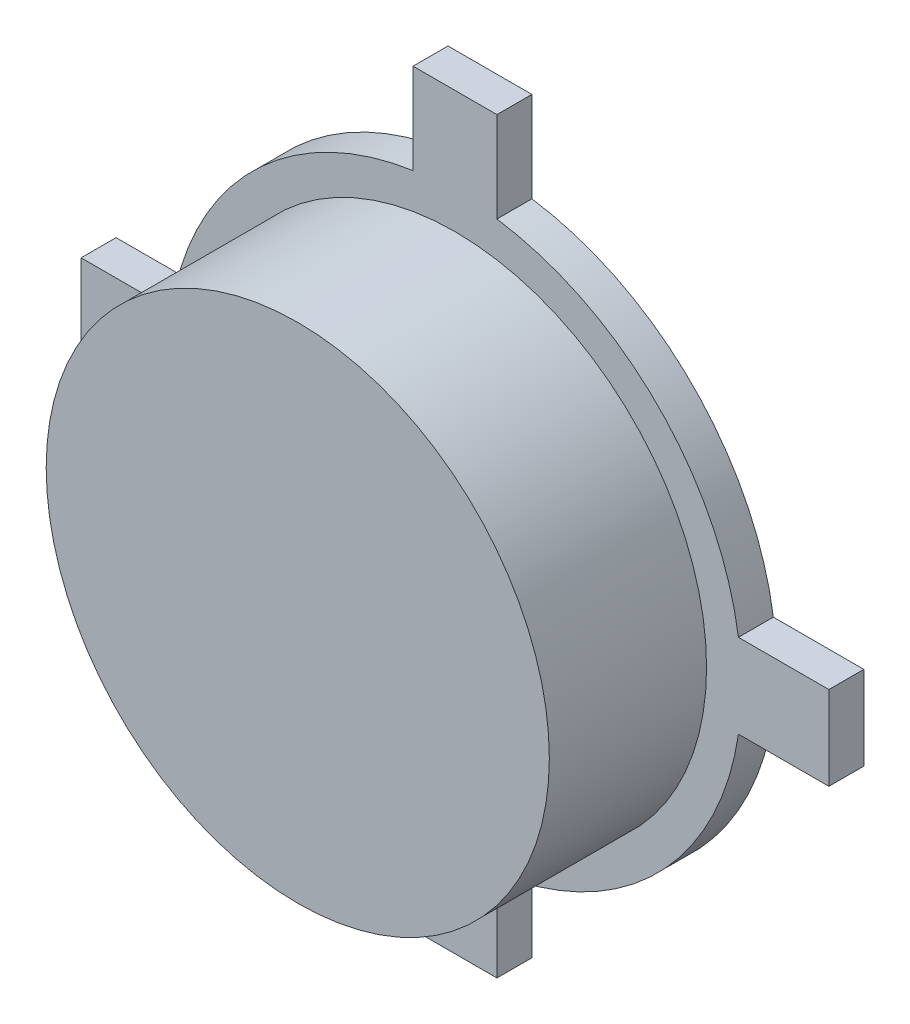
ISO-10303-21;
HEADER;
FILE_DESCRIPTION(('STEP AP214'),'2;1');
FILE_NAME('part.step','',(''),(''),'','','');
FILE_SCHEMA(('AUTOMOTIVE_DESIGN { 1 0 10303 214 1 1 1 1 }'));
ENDSEC;
DATA;
#1=APPLICATION_CONTEXT('core data for automotive mechanical design processes');
#2=APPLICATION_PROTOCOL_DEFINITION('international standard','automotive_design',2000,#1);
#3=PRODUCT_CONTEXT('',#1,'mechanical');
#4=PRODUCT('Part','Part','',(#3));
#5=PRODUCT_RELATED_PRODUCT_CATEGORY('part','',(#4));
#6=PRODUCT_DEFINITION_FORMATION('','',#4);
#7=PRODUCT_DEFINITION_CONTEXT('part definition',#1,'design');
#8=PRODUCT_DEFINITION('design','',#6,#7);
#9=PRODUCT_DEFINITION_SHAPE('','',#8);
#10=(LENGTH_UNIT() NAMED_UNIT(*) SI_UNIT(.MILLI.,.METRE.));
#11=(NAMED_UNIT(*) PLANE_ANGLE_UNIT() SI_UNIT($,.RADIAN.));
#12=(NAMED_UNIT(*) SI_UNIT($,.STERADIAN.) SOLID_ANGLE_UNIT());
#13=UNCERTAINTY_MEASURE_WITH_UNIT(LENGTH_MEASURE(1.E-05),#10,'distance_accuracy_value','');
#14=(GEOMETRIC_REPRESENTATION_CONTEXT(3) GLOBAL_UNCERTAINTY_ASSIGNED_CONTEXT((#13)) GLOBAL_UNIT_ASSIGNED_CONTEXT((#10,
#11,#12)) REPRESENTATION_CONTEXT('',''));
#15=CARTESIAN_POINT('',(0.,0.,0.));
#16=DIRECTION('',(0.,0.,1.));
#17=DIRECTION('',(1.,0.,0.));
#18=AXIS2_PLACEMENT_3D('',#15,#16,#17);
#19=CARTESIAN_POINT('',(0.,0.,4.5));
#20=DIRECTION('',(0.,0.,-1.));
#21=DIRECTION('',(-1.,0.,0.));
#22=AXIS2_PLACEMENT_3D('',#19,#20,#21);
#23=CYLINDRICAL_SURFACE('',#22,7.19999999999999);
#24=CARTESIAN_POINT('',(0.,0.,4.5));
#25=DIRECTION('',(0.,0.,1.));
#26=DIRECTION('',(1.,0.,0.));
#27=AXIS2_PLACEMENT_3D('',#24,#25,#26);
#28=CIRCLE('',#27,7.19999999999999);
#29=CARTESIAN_POINT('',(7.19999999999999,0.,4.5));
#30=VERTEX_POINT('',#29);
#31=EDGE_CURVE('E11',#30,#30,#28,.T.);
#32=ORIENTED_EDGE('',*,*,#31,.F.);
#33=EDGE_LOOP('',(#32));
#34=FACE_BOUND('',#33,.T.);
#35=CARTESIAN_POINT('',(0.,0.,0.));
#36=DIRECTION('',(0.,0.,-1.));
#37=DIRECTION('',(-1.,0.,0.));
#38=AXIS2_PLACEMENT_3D('',#35,#36,#37);
#39=CIRCLE('',#38,7.19999999999999);
#40=CARTESIAN_POINT('',(-7.19999999999999,0.,0.));
#41=VERTEX_POINT('',#40);
#42=EDGE_CURVE('E43',#41,#41,#39,.T.);
#43=ORIENTED_EDGE('',*,*,#42,.F.);
#44=EDGE_LOOP('',(#43));
#45=FACE_BOUND('',#44,.T.);
#46=ADVANCED_FACE('F35',(#34,#45),#23,.T.);
#47=CARTESIAN_POINT('',(0.,0.,4.5));
#48=DIRECTION('',(0.,0.,1.));
#49=DIRECTION('',(1.,0.,0.));
#50=AXIS2_PLACEMENT_3D('',#47,#48,#49);
#51=PLANE('',#50);
#52=ORIENTED_EDGE('',*,*,#31,.T.);
#53=EDGE_LOOP('',(#52));
#54=FACE_BOUND('',#53,.T.);
#55=ADVANCED_FACE('F255',(#54),#51,.T.);
#56=CARTESIAN_POINT('',(-10.7,-1.20000000000001,-1.));
#57=DIRECTION('',(1.,0.,0.));
#58=DIRECTION('',(0.,0.,-1.));
#59=AXIS2_PLACEMENT_3D('',#56,#57,#58);
#60=PLANE('',#59);
#61=DIRECTION('',(0.,1.,0.));
#62=VECTOR('',#61,1.);
#63=CARTESIAN_POINT('',(-10.7,-1.20000000000001,0.));
#64=LINE('',#63,#62);
#65=CARTESIAN_POINT('',(-10.7,-1.20000000000001,0.));
#66=VERTEX_POINT('',#65);
#67=CARTESIAN_POINT('',(-10.7,1.20000000000001,0.));
#68=VERTEX_POINT('',#67);
#69=EDGE_CURVE('E180',#66,#68,#64,.T.);
#70=ORIENTED_EDGE('',*,*,#69,.T.);
#71=DIRECTION('',(0.,0.,1.));
#72=VECTOR('',#71,1.);
#73=CARTESIAN_POINT('',(-10.7,1.20000000000001,-1.));
#74=LINE('',#73,#72);
#75=CARTESIAN_POINT('',(-10.7,1.20000000000001,-1.));
#76=VERTEX_POINT('',#75);
#77=EDGE_CURVE('E247',#76,#68,#74,.T.);
#78=ORIENTED_EDGE('',*,*,#77,.F.);
#79=DIRECTION('',(0.,1.,0.));
#80=VECTOR('',#79,1.);
#81=CARTESIAN_POINT('',(-10.7,-1.20000000000001,-1.));
#82=LINE('',#81,#80);
#83=CARTESIAN_POINT('',(-10.7,-1.20000000000001,-1.));
#84=VERTEX_POINT('',#83);
#85=EDGE_CURVE('E210',#84,#76,#82,.T.);
#86=ORIENTED_EDGE('',*,*,#85,.F.);
#87=DIRECTION('',(0.,0.,1.));
#88=VECTOR('',#87,1.);
#89=CARTESIAN_POINT('',(-10.7,-1.20000000000001,-1.));
#90=LINE('',#89,#88);
#91=EDGE_CURVE('E176',#84,#66,#90,.T.);
#92=ORIENTED_EDGE('',*,*,#91,.T.);
#93=EDGE_LOOP('',(#70,#78,#86,#92));
#94=FACE_BOUND('',#93,.T.);
#95=ADVANCED_FACE('F260',(#94),#60,.F.);
#96=CARTESIAN_POINT('',(-10.7,1.20000000000001,-1.));
#97=DIRECTION('',(0.,-1.,0.));
#98=DIRECTION('',(1.,0.,0.));
#99=AXIS2_PLACEMENT_3D('',#96,#97,#98);
#100=PLANE('',#99);
#101=DIRECTION('',(1.,0.,0.));
#102=VECTOR('',#101,1.);
#103=CARTESIAN_POINT('',(-10.7,1.20000000000001,0.));
#104=LINE('',#103,#102);
#105=CARTESIAN_POINT('',(-8.11171991626927,1.2000000000001,0.));
#106=VERTEX_POINT('',#105);
#107=EDGE_CURVE('E183',#68,#106,#104,.T.);
#108=ORIENTED_EDGE('',*,*,#107,.T.);
#109=DIRECTION('',(0.,0.,1.));
#110=VECTOR('',#109,1.);
#111=CARTESIAN_POINT('',(-8.11171991626927,1.2000000000001,-1.));
#112=LINE('',#111,#110);
#113=CARTESIAN_POINT('',(-8.11171991626927,1.2000000000001,-1.));
#114=VERTEX_POINT('',#113);
#115=EDGE_CURVE('E244',#114,#106,#112,.T.);
#116=ORIENTED_EDGE('',*,*,#115,.F.);
#117=DIRECTION('',(1.,0.,0.));
#118=VECTOR('',#117,1.);
#119=CARTESIAN_POINT('',(-10.7,1.20000000000001,-1.));
#120=LINE('',#119,#118);
#121=EDGE_CURVE('E119',#76,#114,#120,.T.);
#122=ORIENTED_EDGE('',*,*,#121,.F.);
#123=ORIENTED_EDGE('',*,*,#77,.T.);
#124=EDGE_LOOP('',(#108,#116,#122,#123));
#125=FACE_BOUND('',#124,.T.);
#126=ADVANCED_FACE('F266',(#125),#100,.F.);
#127=CARTESIAN_POINT('',(0.,0.,-1.));
#128=DIRECTION('',(0.,0.,1.));
#129=DIRECTION('',(1.,0.,0.));
#130=AXIS2_PLACEMENT_3D('',#127,#128,#129);
#131=CYLINDRICAL_SURFACE('',#130,8.19999999999999);
#132=CARTESIAN_POINT('',(0.,0.,0.));
#133=DIRECTION('',(0.,0.,-1.));
#134=DIRECTION('',(-1.,0.,0.));
#135=AXIS2_PLACEMENT_3D('',#132,#133,#134);
#136=CIRCLE('',#135,8.19999999999999);
#137=CARTESIAN_POINT('',(-1.20000000000012,8.11171991626927,0.));
#138=VERTEX_POINT('',#137);
#139=EDGE_CURVE('E185',#106,#138,#136,.T.);
#140=ORIENTED_EDGE('',*,*,#139,.T.);
#141=DIRECTION('',(0.,0.,1.));
#142=VECTOR('',#141,1.);
#143=CARTESIAN_POINT('',(-1.20000000000012,8.11171991626927,-1.));
#144=LINE('',#143,#142);
#145=CARTESIAN_POINT('',(-1.20000000000012,8.11171991626927,-1.));
#146=VERTEX_POINT('',#145);
#147=EDGE_CURVE('E241',#146,#138,#144,.T.);
#148=ORIENTED_EDGE('',*,*,#147,.F.);
#149=CARTESIAN_POINT('',(0.,0.,-1.));
#150=DIRECTION('',(0.,0.,-1.));
#151=DIRECTION('',(-1.,0.,0.));
#152=AXIS2_PLACEMENT_3D('',#149,#150,#151);
#153=CIRCLE('',#152,8.19999999999999);
#154=EDGE_CURVE('E450',#114,#146,#153,.T.);
#155=ORIENTED_EDGE('',*,*,#154,.F.);
#156=ORIENTED_EDGE('',*,*,#115,.T.);
#157=EDGE_LOOP('',(#140,#148,#155,#156));
#158=FACE_BOUND('',#157,.T.);
#159=ADVANCED_FACE('F272',(#158),#131,.T.);
#160=CARTESIAN_POINT('',(-1.20000000000012,8.11171991626927,-1.));
#161=DIRECTION('',(1.,0.,0.));
#162=DIRECTION('',(0.,1.,0.));
#163=AXIS2_PLACEMENT_3D('',#160,#161,#162);
#164=PLANE('',#163);
#165=DIRECTION('',(0.,1.,0.));
#166=VECTOR('',#165,1.);
#167=CARTESIAN_POINT('',(-1.20000000000012,8.11171991626927,0.));
#168=LINE('',#167,#166);
#169=CARTESIAN_POINT('',(-1.20000000000001,10.7,0.));
#170=VERTEX_POINT('',#169);
#171=EDGE_CURVE('E187',#138,#170,#168,.T.);
#172=ORIENTED_EDGE('',*,*,#171,.T.);
#173=DIRECTION('',(0.,0.,1.));
#174=VECTOR('',#173,1.);
#175=CARTESIAN_POINT('',(-1.20000000000001,10.7,-1.));
#176=LINE('',#175,#174);
#177=CARTESIAN_POINT('',(-1.20000000000001,10.7,-1.));
#178=VERTEX_POINT('',#177);
#179=EDGE_CURVE('E238',#178,#170,#176,.T.);
#180=ORIENTED_EDGE('',*,*,#179,.F.);
#181=DIRECTION('',(0.,1.,0.));
#182=VECTOR('',#181,1.);
#183=CARTESIAN_POINT('',(-1.20000000000012,8.11171991626927,-1.));
#184=LINE('',#183,#182);
#185=EDGE_CURVE('E454',#146,#178,#184,.T.);
#186=ORIENTED_EDGE('',*,*,#185,.F.);
#187=ORIENTED_EDGE('',*,*,#147,.T.);
#188=EDGE_LOOP('',(#172,#180,#186,#187));
#189=FACE_BOUND('',#188,.T.);
#190=ADVANCED_FACE('F275',(#189),#164,.F.);
#191=CARTESIAN_POINT('',(-1.20000000000001,10.7,-1.));
#192=DIRECTION('',(0.,-1.,0.));
#193=DIRECTION('',(1.,0.,0.));
#194=AXIS2_PLACEMENT_3D('',#191,#192,#193);
#195=PLANE('',#194);
#196=DIRECTION('',(1.,0.,0.));
#197=VECTOR('',#196,1.);
#198=CARTESIAN_POINT('',(-1.20000000000001,10.7,0.));
#199=LINE('',#198,#197);
#200=CARTESIAN_POINT('',(1.20000000000002,10.7,0.));
#201=VERTEX_POINT('',#200);
#202=EDGE_CURVE('E189',#170,#201,#199,.T.);
#203=ORIENTED_EDGE('',*,*,#202,.T.);
#204=DIRECTION('',(0.,0.,1.));
#205=VECTOR('',#204,1.);
#206=CARTESIAN_POINT('',(1.20000000000002,10.7,-1.));
#207=LINE('',#206,#205);
#208=CARTESIAN_POINT('',(1.20000000000002,10.7,-1.));
#209=VERTEX_POINT('',#208);
#210=EDGE_CURVE('E235',#209,#201,#207,.T.);
#211=ORIENTED_EDGE('',*,*,#210,.F.);
#212=DIRECTION('',(1.,0.,0.));
#213=VECTOR('',#212,1.);
#214=CARTESIAN_POINT('',(-1.20000000000001,10.7,-1.));
#215=LINE('',#214,#213);
#216=EDGE_CURVE('E456',#178,#209,#215,.T.);
#217=ORIENTED_EDGE('',*,*,#216,.F.);
#218=ORIENTED_EDGE('',*,*,#179,.T.);
#219=EDGE_LOOP('',(#203,#211,#217,#218));
#220=FACE_BOUND('',#219,.T.);
#221=ADVANCED_FACE('F279',(#220),#195,.F.);
#222=CARTESIAN_POINT('',(1.20000000000002,10.7,-1.));
#223=DIRECTION('',(-1.,0.,0.));
#224=DIRECTION('',(0.,-1.,0.));
#225=AXIS2_PLACEMENT_3D('',#222,#223,#224);
#226=PLANE('',#225);
#227=DIRECTION('',(0.,-1.,0.));
#228=VECTOR('',#227,1.);
#229=CARTESIAN_POINT('',(1.20000000000002,10.7,0.));
#230=LINE('',#229,#228);
#231=CARTESIAN_POINT('',(1.20000000000018,8.11171991626926,0.));
#232=VERTEX_POINT('',#231);
#233=EDGE_CURVE('E191',#201,#232,#230,.T.);
#234=ORIENTED_EDGE('',*,*,#233,.T.);
#235=DIRECTION('',(0.,0.,1.));
#236=VECTOR('',#235,1.);
#237=CARTESIAN_POINT('',(1.20000000000018,8.11171991626926,-1.));
#238=LINE('',#237,#236);
#239=CARTESIAN_POINT('',(1.20000000000018,8.11171991626926,-1.));
#240=VERTEX_POINT('',#239);
#241=EDGE_CURVE('E232',#240,#232,#238,.T.);
#242=ORIENTED_EDGE('',*,*,#241,.F.);
#243=DIRECTION('',(0.,-1.,0.));
#244=VECTOR('',#243,1.);
#245=CARTESIAN_POINT('',(1.20000000000002,10.7,-1.));
#246=LINE('',#245,#244);
#247=EDGE_CURVE('E458',#209,#240,#246,.T.);
#248=ORIENTED_EDGE('',*,*,#247,.F.);
#249=ORIENTED_EDGE('',*,*,#210,.T.);
#250=EDGE_LOOP('',(#234,#242,#248,#249));
#251=FACE_BOUND('',#250,.T.);
#252=ADVANCED_FACE('F283',(#251),#226,.F.);
#253=CARTESIAN_POINT('',(0.,0.,-1.));
#254=DIRECTION('',(0.,0.,1.));
#255=DIRECTION('',(1.,0.,0.));
#256=AXIS2_PLACEMENT_3D('',#253,#254,#255);
#257=CYLINDRICAL_SURFACE('',#256,8.19999999999999);
#258=CARTESIAN_POINT('',(0.,0.,0.));
#259=DIRECTION('',(0.,0.,-1.));
#260=DIRECTION('',(-1.,0.,0.));
#261=AXIS2_PLACEMENT_3D('',#258,#259,#260);
#262=CIRCLE('',#261,8.19999999999999);
#263=CARTESIAN_POINT('',(8.11171991626929,1.20000000000001,0.));
#264=VERTEX_POINT('',#263);
#265=EDGE_CURVE('E193',#232,#264,#262,.T.);
#266=ORIENTED_EDGE('',*,*,#265,.T.);
#267=DIRECTION('',(0.,0.,1.));
#268=VECTOR('',#267,1.);
#269=CARTESIAN_POINT('',(8.11171991626929,1.20000000000001,-1.));
#270=LINE('',#269,#268);
#271=CARTESIAN_POINT('',(8.11171991626929,1.20000000000001,-1.));
#272=VERTEX_POINT('',#271);
#273=EDGE_CURVE('E229',#272,#264,#270,.T.);
#274=ORIENTED_EDGE('',*,*,#273,.F.);
#275=CARTESIAN_POINT('',(0.,0.,-1.));
#276=DIRECTION('',(0.,0.,-1.));
#277=DIRECTION('',(-1.,0.,0.));
#278=AXIS2_PLACEMENT_3D('',#275,#276,#277);
#279=CIRCLE('',#278,8.19999999999999);
#280=EDGE_CURVE('E460',#240,#272,#279,.T.);
#281=ORIENTED_EDGE('',*,*,#280,.F.);
#282=ORIENTED_EDGE('',*,*,#241,.T.);
#283=EDGE_LOOP('',(#266,#274,#281,#282));
#284=FACE_BOUND('',#283,.T.);
#285=ADVANCED_FACE('F287',(#284),#257,.T.);
#286=CARTESIAN_POINT('',(8.11171991626929,1.20000000000001,-1.));
#287=DIRECTION('',(0.,-1.,0.));
#288=DIRECTION('',(0.,0.,-1.));
#289=AXIS2_PLACEMENT_3D('',#286,#287,#288);
#290=PLANE('',#289);
#291=DIRECTION('',(1.,0.,0.));
#292=VECTOR('',#291,1.);
#293=CARTESIAN_POINT('',(8.11171991626929,1.20000000000001,0.));
#294=LINE('',#293,#292);
#295=CARTESIAN_POINT('',(10.7,1.20000000000001,0.));
#296=VERTEX_POINT('',#295);
#297=EDGE_CURVE('E195',#264,#296,#294,.T.);
#298=ORIENTED_EDGE('',*,*,#297,.T.);
#299=DIRECTION('',(0.,0.,1.));
#300=VECTOR('',#299,1.);
#301=CARTESIAN_POINT('',(10.7,1.20000000000001,-1.));
#302=LINE('',#301,#300);
#303=CARTESIAN_POINT('',(10.7,1.20000000000001,-1.));
#304=VERTEX_POINT('',#303);
#305=EDGE_CURVE('E226',#304,#296,#302,.T.);
#306=ORIENTED_EDGE('',*,*,#305,.F.);
#307=DIRECTION('',(1.,0.,0.));
#308=VECTOR('',#307,1.);
#309=CARTESIAN_POINT('',(8.11171991626929,1.20000000000001,-1.));
#310=LINE('',#309,#308);
#311=EDGE_CURVE('E462',#272,#304,#310,.T.);
#312=ORIENTED_EDGE('',*,*,#311,.F.);
#313=ORIENTED_EDGE('',*,*,#273,.T.);
#314=EDGE_LOOP('',(#298,#306,#312,#313));
#315=FACE_BOUND('',#314,.T.);
#316=ADVANCED_FACE('F291',(#315),#290,.F.);
#317=CARTESIAN_POINT('',(10.7,1.20000000000001,-1.));
#318=DIRECTION('',(-1.,0.,0.));
#319=DIRECTION('',(0.,0.,1.));
#320=AXIS2_PLACEMENT_3D('',#317,#318,#319);
#321=PLANE('',#320);
#322=DIRECTION('',(0.,-1.,0.));
#323=VECTOR('',#322,1.);
#324=CARTESIAN_POINT('',(10.7,1.20000000000001,0.));
#325=LINE('',#324,#323);
#326=CARTESIAN_POINT('',(10.7,-1.19999999999999,0.));
#327=VERTEX_POINT('',#326);
#328=EDGE_CURVE('E197',#296,#327,#325,.T.);
#329=ORIENTED_EDGE('',*,*,#328,.T.);
#330=DIRECTION('',(0.,0.,1.));
#331=VECTOR('',#330,1.);
#332=CARTESIAN_POINT('',(10.7,-1.19999999999999,-1.));
#333=LINE('',#332,#331);
#334=CARTESIAN_POINT('',(10.7,-1.19999999999999,-1.));
#335=VERTEX_POINT('',#334);
#336=EDGE_CURVE('E223',#335,#327,#333,.T.);
#337=ORIENTED_EDGE('',*,*,#336,.F.);
#338=DIRECTION('',(0.,-1.,0.));
#339=VECTOR('',#338,1.);
#340=CARTESIAN_POINT('',(10.7,1.20000000000001,-1.));
#341=LINE('',#340,#339);
#342=EDGE_CURVE('E464',#304,#335,#341,.T.);
#343=ORIENTED_EDGE('',*,*,#342,.F.);
#344=ORIENTED_EDGE('',*,*,#305,.T.);
#345=EDGE_LOOP('',(#329,#337,#343,#344));
#346=FACE_BOUND('',#345,.T.);
#347=ADVANCED_FACE('F295',(#346),#321,.F.);
#348=CARTESIAN_POINT('',(10.7,-1.19999999999999,-1.));
#349=DIRECTION('',(0.,1.,0.));
#350=DIRECTION('',(-1.,0.,0.));
#351=AXIS2_PLACEMENT_3D('',#348,#349,#350);
#352=PLANE('',#351);
#353=DIRECTION('',(-1.,0.,0.));
#354=VECTOR('',#353,1.);
#355=CARTESIAN_POINT('',(10.7,-1.19999999999999,0.));
#356=LINE('',#355,#354);
#357=CARTESIAN_POINT('',(8.11171991626929,-1.19999999999998,0.));
#358=VERTEX_POINT('',#357);
#359=EDGE_CURVE('E199',#327,#358,#356,.T.);
#360=ORIENTED_EDGE('',*,*,#359,.T.);
#361=DIRECTION('',(0.,0.,1.));
#362=VECTOR('',#361,1.);
#363=CARTESIAN_POINT('',(8.11171991626929,-1.19999999999998,-1.));
#364=LINE('',#363,#362);
#365=CARTESIAN_POINT('',(8.11171991626929,-1.19999999999998,-1.));
#366=VERTEX_POINT('',#365);
#367=EDGE_CURVE('E220',#366,#358,#364,.T.);
#368=ORIENTED_EDGE('',*,*,#367,.F.);
#369=DIRECTION('',(-1.,0.,0.));
#370=VECTOR('',#369,1.);
#371=CARTESIAN_POINT('',(10.7,-1.19999999999999,-1.));
#372=LINE('',#371,#370);
#373=EDGE_CURVE('E466',#335,#366,#372,.T.);
#374=ORIENTED_EDGE('',*,*,#373,.F.);
#375=ORIENTED_EDGE('',*,*,#336,.T.);
#376=EDGE_LOOP('',(#360,#368,#374,#375));
#377=FACE_BOUND('',#376,.T.);
#378=ADVANCED_FACE('F299',(#377),#352,.F.);
#379=CARTESIAN_POINT('',(0.,0.,-1.));
#380=DIRECTION('',(0.,0.,1.));
#381=DIRECTION('',(1.,0.,0.));
#382=AXIS2_PLACEMENT_3D('',#379,#380,#381);
#383=CYLINDRICAL_SURFACE('',#382,8.19999999999999);
#384=CARTESIAN_POINT('',(0.,0.,0.));
#385=DIRECTION('',(0.,0.,-1.));
#386=DIRECTION('',(-1.,0.,0.));
#387=AXIS2_PLACEMENT_3D('',#384,#385,#386);
#388=CIRCLE('',#387,8.19999999999999);
#389=CARTESIAN_POINT('',(1.2,-8.11171991626928,0.));
#390=VERTEX_POINT('',#389);
#391=EDGE_CURVE('E201',#358,#390,#388,.T.);
#392=ORIENTED_EDGE('',*,*,#391,.T.);
#393=DIRECTION('',(0.,0.,1.));
#394=VECTOR('',#393,1.);
#395=CARTESIAN_POINT('',(1.2,-8.11171991626928,-1.));
#396=LINE('',#395,#394);
#397=CARTESIAN_POINT('',(1.2,-8.11171991626928,-1.));
#398=VERTEX_POINT('',#397);
#399=EDGE_CURVE('E217',#398,#390,#396,.T.);
#400=ORIENTED_EDGE('',*,*,#399,.F.);
#401=CARTESIAN_POINT('',(0.,0.,-1.));
#402=DIRECTION('',(0.,0.,-1.));
#403=DIRECTION('',(-1.,0.,0.));
#404=AXIS2_PLACEMENT_3D('',#401,#402,#403);
#405=CIRCLE('',#404,8.19999999999999);
#406=EDGE_CURVE('E468',#366,#398,#405,.T.);
#407=ORIENTED_EDGE('',*,*,#406,.F.);
#408=ORIENTED_EDGE('',*,*,#367,.T.);
#409=EDGE_LOOP('',(#392,#400,#407,#408));
#410=FACE_BOUND('',#409,.T.);
#411=ADVANCED_FACE('F303',(#410),#383,.T.);
#412=CARTESIAN_POINT('',(1.2,-8.11171991626928,-1.));
#413=DIRECTION('',(-1.,0.,0.));
#414=DIRECTION('',(0.,0.,1.));
#415=AXIS2_PLACEMENT_3D('',#412,#413,#414);
#416=PLANE('',#415);
#417=DIRECTION('',(0.,-1.,0.));
#418=VECTOR('',#417,1.);
#419=CARTESIAN_POINT('',(1.2,-8.11171991626928,0.));
#420=LINE('',#419,#418);
#421=CARTESIAN_POINT('',(1.2,-10.7,0.));
#422=VERTEX_POINT('',#421);
#423=EDGE_CURVE('E203',#390,#422,#420,.T.);
#424=ORIENTED_EDGE('',*,*,#423,.T.);
#425=DIRECTION('',(0.,0.,1.));
#426=VECTOR('',#425,1.);
#427=CARTESIAN_POINT('',(1.2,-10.7,-1.));
#428=LINE('',#427,#426);
#429=CARTESIAN_POINT('',(1.2,-10.7,-1.));
#430=VERTEX_POINT('',#429);
#431=EDGE_CURVE('E214',#430,#422,#428,.T.);
#432=ORIENTED_EDGE('',*,*,#431,.F.);
#433=DIRECTION('',(0.,-1.,0.));
#434=VECTOR('',#433,1.);
#435=CARTESIAN_POINT('',(1.2,-8.11171991626928,-1.));
#436=LINE('',#435,#434);
#437=EDGE_CURVE('E470',#398,#430,#436,.T.);
#438=ORIENTED_EDGE('',*,*,#437,.F.);
#439=ORIENTED_EDGE('',*,*,#399,.T.);
#440=EDGE_LOOP('',(#424,#432,#438,#439));
#441=FACE_BOUND('',#440,.T.);
#442=ADVANCED_FACE('F307',(#441),#416,.F.);
#443=CARTESIAN_POINT('',(1.2,-10.7,-1.));
#444=DIRECTION('',(0.,1.,0.));
#445=DIRECTION('',(-1.,0.,0.));
#446=AXIS2_PLACEMENT_3D('',#443,#444,#445);
#447=PLANE('',#446);
#448=DIRECTION('',(-1.,0.,0.));
#449=VECTOR('',#448,1.);
#450=CARTESIAN_POINT('',(1.2,-10.7,0.));
#451=LINE('',#450,#449);
#452=CARTESIAN_POINT('',(-1.2,-10.7,0.));
#453=VERTEX_POINT('',#452);
#454=EDGE_CURVE('E205',#422,#453,#451,.T.);
#455=ORIENTED_EDGE('',*,*,#454,.T.);
#456=DIRECTION('',(0.,0.,1.));
#457=VECTOR('',#456,1.);
#458=CARTESIAN_POINT('',(-1.2,-10.7,-1.));
#459=LINE('',#458,#457);
#460=CARTESIAN_POINT('',(-1.2,-10.7,-1.));
#461=VERTEX_POINT('',#460);
#462=EDGE_CURVE('E171',#461,#453,#459,.T.);
#463=ORIENTED_EDGE('',*,*,#462,.F.);
#464=DIRECTION('',(-1.,0.,0.));
#465=VECTOR('',#464,1.);
#466=CARTESIAN_POINT('',(1.2,-10.7,-1.));
#467=LINE('',#466,#465);
#468=EDGE_CURVE('E162',#430,#461,#467,.T.);
#469=ORIENTED_EDGE('',*,*,#468,.F.);
#470=ORIENTED_EDGE('',*,*,#431,.T.);
#471=EDGE_LOOP('',(#455,#463,#469,#470));
#472=FACE_BOUND('',#471,.T.);
#473=ADVANCED_FACE('F311',(#472),#447,.F.);
#474=CARTESIAN_POINT('',(-1.2,-10.7,-1.));
#475=DIRECTION('',(1.,0.,0.));
#476=DIRECTION('',(0.,1.,0.));
#477=AXIS2_PLACEMENT_3D('',#474,#475,#476);
#478=PLANE('',#477);
#479=DIRECTION('',(0.,1.,0.));
#480=VECTOR('',#479,1.);
#481=CARTESIAN_POINT('',(-1.2,-10.7,0.));
#482=LINE('',#481,#480);
#483=CARTESIAN_POINT('',(-1.20000000000001,-8.11171991626929,0.));
#484=VERTEX_POINT('',#483);
#485=EDGE_CURVE('E170',#453,#484,#482,.T.);
#486=ORIENTED_EDGE('',*,*,#485,.T.);
#487=DIRECTION('',(0.,0.,1.));
#488=VECTOR('',#487,1.);
#489=CARTESIAN_POINT('',(-1.20000000000001,-8.11171991626929,-1.));
#490=LINE('',#489,#488);
#491=CARTESIAN_POINT('',(-1.20000000000001,-8.11171991626929,-1.));
#492=VERTEX_POINT('',#491);
#493=EDGE_CURVE('E167',#492,#484,#490,.T.);
#494=ORIENTED_EDGE('',*,*,#493,.F.);
#495=DIRECTION('',(0.,1.,0.));
#496=VECTOR('',#495,1.);
#497=CARTESIAN_POINT('',(-1.2,-10.7,-1.));
#498=LINE('',#497,#496);
#499=EDGE_CURVE('E156',#461,#492,#498,.T.);
#500=ORIENTED_EDGE('',*,*,#499,.F.);
#501=ORIENTED_EDGE('',*,*,#462,.T.);
#502=EDGE_LOOP('',(#486,#494,#500,#501));
#503=FACE_BOUND('',#502,.T.);
#504=ADVANCED_FACE('F168',(#503),#478,.F.);
#505=CARTESIAN_POINT('',(0.,0.,-1.));
#506=DIRECTION('',(0.,0.,1.));
#507=DIRECTION('',(1.,0.,0.));
#508=AXIS2_PLACEMENT_3D('',#505,#506,#507);
#509=CYLINDRICAL_SURFACE('',#508,8.19999999999999);
#510=CARTESIAN_POINT('',(0.,0.,0.));
#511=DIRECTION('',(0.,0.,-1.));
#512=DIRECTION('',(-1.,0.,0.));
#513=AXIS2_PLACEMENT_3D('',#510,#511,#512);
#514=CIRCLE('',#513,8.19999999999999);
#515=CARTESIAN_POINT('',(-8.11171991626927,-1.20000000000012,0.));
#516=VERTEX_POINT('',#515);
#517=EDGE_CURVE('E104',#484,#516,#514,.T.);
#518=ORIENTED_EDGE('',*,*,#517,.T.);
#519=DIRECTION('',(0.,0.,1.));
#520=VECTOR('',#519,1.);
#521=CARTESIAN_POINT('',(-8.11171991626927,-1.20000000000012,-1.));
#522=LINE('',#521,#520);
#523=CARTESIAN_POINT('',(-8.11171991626927,-1.20000000000012,-1.));
#524=VERTEX_POINT('',#523);
#525=EDGE_CURVE('E172',#524,#516,#522,.T.);
#526=ORIENTED_EDGE('',*,*,#525,.F.);
#527=CARTESIAN_POINT('',(0.,0.,-1.));
#528=DIRECTION('',(0.,0.,-1.));
#529=DIRECTION('',(-1.,0.,0.));
#530=AXIS2_PLACEMENT_3D('',#527,#528,#529);
#531=CIRCLE('',#530,8.19999999999999);
#532=EDGE_CURVE('E160',#492,#524,#531,.T.);
#533=ORIENTED_EDGE('',*,*,#532,.F.);
#534=ORIENTED_EDGE('',*,*,#493,.T.);
#535=EDGE_LOOP('',(#518,#526,#533,#534));
#536=FACE_BOUND('',#535,.T.);
#537=ADVANCED_FACE('F174',(#536),#509,.T.);
#538=CARTESIAN_POINT('',(-8.11171991626927,-1.20000000000012,-1.));
#539=DIRECTION('',(0.,1.,0.));
#540=DIRECTION('',(-1.,0.,0.));
#541=AXIS2_PLACEMENT_3D('',#538,#539,#540);
#542=PLANE('',#541);
#543=DIRECTION('',(-1.,0.,0.));
#544=VECTOR('',#543,1.);
#545=CARTESIAN_POINT('',(-8.11171991626927,-1.20000000000012,0.));
#546=LINE('',#545,#544);
#547=EDGE_CURVE('E110',#516,#66,#546,.T.);
#548=ORIENTED_EDGE('',*,*,#547,.T.);
#549=ORIENTED_EDGE('',*,*,#91,.F.);
#550=DIRECTION('',(-1.,0.,0.));
#551=VECTOR('',#550,1.);
#552=CARTESIAN_POINT('',(-8.11171991626927,-1.20000000000012,-1.));
#553=LINE('',#552,#551);
#554=EDGE_CURVE('E51',#524,#84,#553,.T.);
#555=ORIENTED_EDGE('',*,*,#554,.F.);
#556=ORIENTED_EDGE('',*,*,#525,.T.);
#557=EDGE_LOOP('',(#548,#549,#555,#556));
#558=FACE_BOUND('',#557,.T.);
#559=ADVANCED_FACE('F320',(#558),#542,.F.);
#560=CARTESIAN_POINT('',(0.,0.,-1.));
#561=DIRECTION('',(0.,0.,-1.));
#562=DIRECTION('',(-1.,0.,0.));
#563=AXIS2_PLACEMENT_3D('',#560,#561,#562);
#564=PLANE('',#563);
#565=ORIENTED_EDGE('',*,*,#85,.T.);
#566=ORIENTED_EDGE('',*,*,#121,.T.);
#567=ORIENTED_EDGE('',*,*,#154,.T.);
#568=ORIENTED_EDGE('',*,*,#185,.T.);
#569=ORIENTED_EDGE('',*,*,#216,.T.);
#570=ORIENTED_EDGE('',*,*,#247,.T.);
#571=ORIENTED_EDGE('',*,*,#280,.T.);
#572=ORIENTED_EDGE('',*,*,#311,.T.);
#573=ORIENTED_EDGE('',*,*,#342,.T.);
#574=ORIENTED_EDGE('',*,*,#373,.T.);
#575=ORIENTED_EDGE('',*,*,#406,.T.);
#576=ORIENTED_EDGE('',*,*,#437,.T.);
#577=ORIENTED_EDGE('',*,*,#468,.T.);
#578=ORIENTED_EDGE('',*,*,#499,.T.);
#579=ORIENTED_EDGE('',*,*,#532,.T.);
#580=ORIENTED_EDGE('',*,*,#554,.T.);
#581=EDGE_LOOP('',(#565,#566,#567,#568,#569,#570,#571,#572,#573,#574,#575,#576,#577,#578,#579,#580));
#582=FACE_BOUND('',#581,.T.);
#583=ADVANCED_FACE('F158',(#582),#564,.T.);
#584=CARTESIAN_POINT('',(0.,0.,0.));
#585=DIRECTION('',(0.,0.,-1.));
#586=DIRECTION('',(-1.,0.,0.));
#587=AXIS2_PLACEMENT_3D('',#584,#585,#586);
#588=PLANE('',#587);
#589=ORIENTED_EDGE('',*,*,#42,.T.);
#590=EDGE_LOOP('',(#589));
#591=FACE_BOUND('',#590,.T.);
#592=ORIENTED_EDGE('',*,*,#69,.F.);
#593=ORIENTED_EDGE('',*,*,#547,.F.);
#594=ORIENTED_EDGE('',*,*,#517,.F.);
#595=ORIENTED_EDGE('',*,*,#485,.F.);
#596=ORIENTED_EDGE('',*,*,#454,.F.);
#597=ORIENTED_EDGE('',*,*,#423,.F.);
#598=ORIENTED_EDGE('',*,*,#391,.F.);
#599=ORIENTED_EDGE('',*,*,#359,.F.);
#600=ORIENTED_EDGE('',*,*,#328,.F.);
#601=ORIENTED_EDGE('',*,*,#297,.F.);
#602=ORIENTED_EDGE('',*,*,#265,.F.);
#603=ORIENTED_EDGE('',*,*,#233,.F.);
#604=ORIENTED_EDGE('',*,*,#202,.F.);
#605=ORIENTED_EDGE('',*,*,#171,.F.);
#606=ORIENTED_EDGE('',*,*,#139,.F.);
#607=ORIENTED_EDGE('',*,*,#107,.F.);
#608=EDGE_LOOP('',(#592,#593,#594,#595,#596,#597,#598,#599,#600,#601,#602,#603,#604,#605,#606,#607));
#609=FACE_BOUND('',#608,.T.);
#610=ADVANCED_FACE('F251',(#591,#609),#588,.F.);
#611=CLOSED_SHELL('',(#46,#55,#95,#126,#159,#190,#221,#252,#285,#316,#347,#378,#411,#442,#473,
#504,#537,#559,#583,#610));
#612=MANIFOLD_SOLID_BREP('B2',#611);
#613=ADVANCED_BREP_SHAPE_REPRESENTATION('',(#18,#612),#14);
#614=SHAPE_DEFINITION_REPRESENTATION(#9,#613);
ENDSEC;
END-ISO-10303-21;
